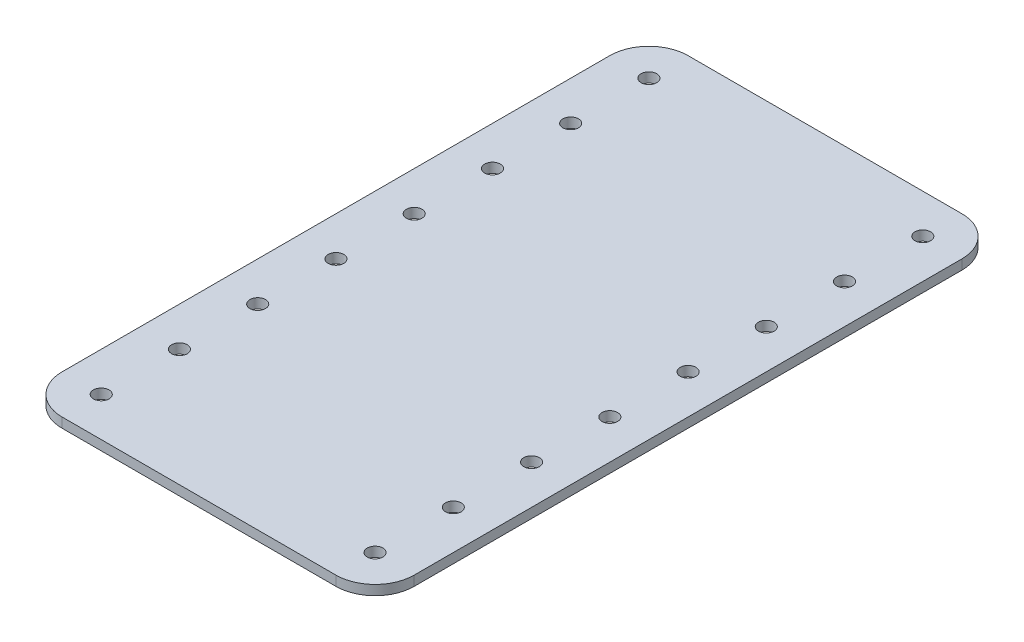
ISO-10303-21;
HEADER;
FILE_DESCRIPTION(('STEP AP214'),'2;1');
FILE_NAME('part.step','',(''),(''),'','','');
FILE_SCHEMA(('AUTOMOTIVE_DESIGN { 1 0 10303 214 1 1 1 1 }'));
ENDSEC;
DATA;
#1=APPLICATION_CONTEXT('core data for automotive mechanical design processes');
#2=APPLICATION_PROTOCOL_DEFINITION('international standard','automotive_design',2000,#1);
#3=PRODUCT_CONTEXT('',#1,'mechanical');
#4=PRODUCT('Part','Part','',(#3));
#5=PRODUCT_RELATED_PRODUCT_CATEGORY('part','',(#4));
#6=PRODUCT_DEFINITION_FORMATION('','',#4);
#7=PRODUCT_DEFINITION_CONTEXT('part definition',#1,'design');
#8=PRODUCT_DEFINITION('design','',#6,#7);
#9=PRODUCT_DEFINITION_SHAPE('','',#8);
#10=(LENGTH_UNIT() NAMED_UNIT(*) SI_UNIT(.MILLI.,.METRE.));
#11=(NAMED_UNIT(*) PLANE_ANGLE_UNIT() SI_UNIT($,.RADIAN.));
#12=(NAMED_UNIT(*) SI_UNIT($,.STERADIAN.) SOLID_ANGLE_UNIT());
#13=UNCERTAINTY_MEASURE_WITH_UNIT(LENGTH_MEASURE(1.E-05),#10,'distance_accuracy_value','');
#14=(GEOMETRIC_REPRESENTATION_CONTEXT(3) GLOBAL_UNCERTAINTY_ASSIGNED_CONTEXT((#13)) GLOBAL_UNIT_ASSIGNED_CONTEXT((#10,
#11,#12)) REPRESENTATION_CONTEXT('',''));
#15=CARTESIAN_POINT('',(0.,0.,0.));
#16=DIRECTION('',(0.,0.,1.));
#17=DIRECTION('',(1.,0.,0.));
#18=AXIS2_PLACEMENT_3D('',#15,#16,#17);
#19=CARTESIAN_POINT('',(57.15,3.175,101.6));
#20=DIRECTION('',(-1.,0.,0.));
#21=DIRECTION('',(0.,0.,1.));
#22=AXIS2_PLACEMENT_3D('',#19,#20,#21);
#23=PLANE('',#22);
#24=DIRECTION('',(0.,0.,-1.));
#25=VECTOR('',#24,1.);
#26=CARTESIAN_POINT('',(57.15,0.,101.6));
#27=LINE('',#26,#25);
#28=CARTESIAN_POINT('',(57.15,0.,88.9));
#29=VERTEX_POINT('',#28);
#30=CARTESIAN_POINT('',(57.15,0.,-88.9));
#31=VERTEX_POINT('',#30);
#32=EDGE_CURVE('E127',#29,#31,#27,.T.);
#33=ORIENTED_EDGE('',*,*,#32,.T.);
#34=DIRECTION('',(0.,-1.,0.));
#35=VECTOR('',#34,1.);
#36=CARTESIAN_POINT('',(57.15,3.175,-88.9));
#37=LINE('',#36,#35);
#38=CARTESIAN_POINT('',(57.15,3.175,-88.9));
#39=VERTEX_POINT('',#38);
#40=EDGE_CURVE('E150',#31,#39,#37,.F.);
#41=ORIENTED_EDGE('',*,*,#40,.T.);
#42=DIRECTION('',(0.,0.,-1.));
#43=VECTOR('',#42,1.);
#44=CARTESIAN_POINT('',(57.15,3.175,101.6));
#45=LINE('',#44,#43);
#46=CARTESIAN_POINT('',(57.15,3.175,88.9));
#47=VERTEX_POINT('',#46);
#48=EDGE_CURVE('E125',#47,#39,#45,.T.);
#49=ORIENTED_EDGE('',*,*,#48,.F.);
#50=DIRECTION('',(0.,-1.,0.));
#51=VECTOR('',#50,1.);
#52=CARTESIAN_POINT('',(57.15,3.175,88.9));
#53=LINE('',#52,#51);
#54=EDGE_CURVE('E147',#47,#29,#53,.T.);
#55=ORIENTED_EDGE('',*,*,#54,.T.);
#56=EDGE_LOOP('',(#33,#41,#49,#55));
#57=FACE_BOUND('',#56,.T.);
#58=ADVANCED_FACE('F32',(#57),#23,.F.);
#59=CARTESIAN_POINT('',(-57.15,3.175,-101.6));
#60=DIRECTION('',(0.,0.,1.));
#61=DIRECTION('',(1.,0.,0.));
#62=AXIS2_PLACEMENT_3D('',#59,#60,#61);
#63=PLANE('',#62);
#64=DIRECTION('',(-1.,0.,0.));
#65=VECTOR('',#64,1.);
#66=CARTESIAN_POINT('',(-57.15,0.,-101.6));
#67=LINE('',#66,#65);
#68=CARTESIAN_POINT('',(44.45,0.,-101.6));
#69=VERTEX_POINT('',#68);
#70=CARTESIAN_POINT('',(-44.45,0.,-101.6));
#71=VERTEX_POINT('',#70);
#72=EDGE_CURVE('E123',#69,#71,#67,.T.);
#73=ORIENTED_EDGE('',*,*,#72,.T.);
#74=DIRECTION('',(0.,-1.,0.));
#75=VECTOR('',#74,1.);
#76=CARTESIAN_POINT('',(-44.45,3.175,-101.6));
#77=LINE('',#76,#75);
#78=CARTESIAN_POINT('',(-44.45,3.175,-101.6));
#79=VERTEX_POINT('',#78);
#80=EDGE_CURVE('E102',#71,#79,#77,.F.);
#81=ORIENTED_EDGE('',*,*,#80,.T.);
#82=DIRECTION('',(-1.,0.,0.));
#83=VECTOR('',#82,1.);
#84=CARTESIAN_POINT('',(-57.15,3.175,-101.6));
#85=LINE('',#84,#83);
#86=CARTESIAN_POINT('',(44.45,3.175,-101.6));
#87=VERTEX_POINT('',#86);
#88=EDGE_CURVE('E166',#87,#79,#85,.T.);
#89=ORIENTED_EDGE('',*,*,#88,.F.);
#90=DIRECTION('',(0.,-1.,0.));
#91=VECTOR('',#90,1.);
#92=CARTESIAN_POINT('',(44.45,3.175,-101.6));
#93=LINE('',#92,#91);
#94=EDGE_CURVE('E107',#87,#69,#93,.T.);
#95=ORIENTED_EDGE('',*,*,#94,.T.);
#96=EDGE_LOOP('',(#73,#81,#89,#95));
#97=FACE_BOUND('',#96,.T.);
#98=ADVANCED_FACE('F317',(#97),#63,.F.);
#99=CARTESIAN_POINT('',(-57.15,3.175,101.6));
#100=DIRECTION('',(1.,0.,0.));
#101=DIRECTION('',(0.,0.,-1.));
#102=AXIS2_PLACEMENT_3D('',#99,#100,#101);
#103=PLANE('',#102);
#104=DIRECTION('',(0.,0.,1.));
#105=VECTOR('',#104,1.);
#106=CARTESIAN_POINT('',(-57.15,3.175,101.6));
#107=LINE('',#106,#105);
#108=CARTESIAN_POINT('',(-57.15,3.175,-88.9));
#109=VERTEX_POINT('',#108);
#110=CARTESIAN_POINT('',(-57.15,3.175,88.9));
#111=VERTEX_POINT('',#110);
#112=EDGE_CURVE('E116',#109,#111,#107,.T.);
#113=ORIENTED_EDGE('',*,*,#112,.F.);
#114=DIRECTION('',(0.,-1.,0.));
#115=VECTOR('',#114,1.);
#116=CARTESIAN_POINT('',(-57.15,3.175,-88.9));
#117=LINE('',#116,#115);
#118=CARTESIAN_POINT('',(-57.15,0.,-88.9));
#119=VERTEX_POINT('',#118);
#120=EDGE_CURVE('E101',#109,#119,#117,.T.);
#121=ORIENTED_EDGE('',*,*,#120,.T.);
#122=DIRECTION('',(0.,0.,1.));
#123=VECTOR('',#122,1.);
#124=CARTESIAN_POINT('',(-57.15,0.,101.6));
#125=LINE('',#124,#123);
#126=CARTESIAN_POINT('',(-57.15,0.,88.9));
#127=VERTEX_POINT('',#126);
#128=EDGE_CURVE('E114',#119,#127,#125,.T.);
#129=ORIENTED_EDGE('',*,*,#128,.T.);
#130=DIRECTION('',(0.,-1.,0.));
#131=VECTOR('',#130,1.);
#132=CARTESIAN_POINT('',(-57.15,3.175,88.9));
#133=LINE('',#132,#131);
#134=EDGE_CURVE('E118',#127,#111,#133,.F.);
#135=ORIENTED_EDGE('',*,*,#134,.T.);
#136=EDGE_LOOP('',(#113,#121,#129,#135));
#137=FACE_BOUND('',#136,.T.);
#138=ADVANCED_FACE('F113',(#137),#103,.F.);
#139=CARTESIAN_POINT('',(-57.15,3.175,101.6));
#140=DIRECTION('',(0.,0.,-1.));
#141=DIRECTION('',(-1.,0.,0.));
#142=AXIS2_PLACEMENT_3D('',#139,#140,#141);
#143=PLANE('',#142);
#144=DIRECTION('',(1.,0.,0.));
#145=VECTOR('',#144,1.);
#146=CARTESIAN_POINT('',(-57.15,0.,101.6));
#147=LINE('',#146,#145);
#148=CARTESIAN_POINT('',(-44.45,0.,101.6));
#149=VERTEX_POINT('',#148);
#150=CARTESIAN_POINT('',(44.45,0.,101.6));
#151=VERTEX_POINT('',#150);
#152=EDGE_CURVE('E122',#149,#151,#147,.T.);
#153=ORIENTED_EDGE('',*,*,#152,.T.);
#154=DIRECTION('',(0.,-1.,0.));
#155=VECTOR('',#154,1.);
#156=CARTESIAN_POINT('',(44.45,3.175,101.6));
#157=LINE('',#156,#155);
#158=CARTESIAN_POINT('',(44.45,3.175,101.6));
#159=VERTEX_POINT('',#158);
#160=EDGE_CURVE('E11',#151,#159,#157,.F.);
#161=ORIENTED_EDGE('',*,*,#160,.T.);
#162=DIRECTION('',(1.,0.,0.));
#163=VECTOR('',#162,1.);
#164=CARTESIAN_POINT('',(-57.15,3.175,101.6));
#165=LINE('',#164,#163);
#166=CARTESIAN_POINT('',(-44.45,3.175,101.6));
#167=VERTEX_POINT('',#166);
#168=EDGE_CURVE('E131',#167,#159,#165,.T.);
#169=ORIENTED_EDGE('',*,*,#168,.F.);
#170=DIRECTION('',(0.,-1.,0.));
#171=VECTOR('',#170,1.);
#172=CARTESIAN_POINT('',(-44.45,3.175,101.6));
#173=LINE('',#172,#171);
#174=EDGE_CURVE('E40',#167,#149,#173,.T.);
#175=ORIENTED_EDGE('',*,*,#174,.T.);
#176=EDGE_LOOP('',(#153,#161,#169,#175));
#177=FACE_BOUND('',#176,.T.);
#178=ADVANCED_FACE('F153',(#177),#143,.F.);
#179=CARTESIAN_POINT('',(0.,3.175,0.));
#180=DIRECTION('',(0.,-1.,0.));
#181=DIRECTION('',(0.,0.,-1.));
#182=AXIS2_PLACEMENT_3D('',#179,#180,#181);
#183=PLANE('',#182);
#184=CARTESIAN_POINT('',(44.45,3.175,-88.9));
#185=DIRECTION('',(0.,1.,0.));
#186=DIRECTION('',(0.,0.,-1.));
#187=AXIS2_PLACEMENT_3D('',#184,#185,#186);
#188=CIRCLE('',#187,2.54);
#189=CARTESIAN_POINT('',(44.45,3.175,-91.44));
#190=VERTEX_POINT('',#189);
#191=EDGE_CURVE('E266',#190,#190,#188,.T.);
#192=ORIENTED_EDGE('',*,*,#191,.F.);
#193=EDGE_LOOP('',(#192));
#194=FACE_BOUND('',#193,.T.);
#195=CARTESIAN_POINT('',(44.4499999999997,3.175,-63.5));
#196=DIRECTION('',(0.,1.,0.));
#197=DIRECTION('',(0.,0.,-1.));
#198=AXIS2_PLACEMENT_3D('',#195,#196,#197);
#199=CIRCLE('',#198,2.54);
#200=CARTESIAN_POINT('',(44.4499999999997,3.175,-66.04));
#201=VERTEX_POINT('',#200);
#202=EDGE_CURVE('E260',#201,#201,#199,.T.);
#203=ORIENTED_EDGE('',*,*,#202,.F.);
#204=EDGE_LOOP('',(#203));
#205=FACE_BOUND('',#204,.T.);
#206=CARTESIAN_POINT('',(44.4499999999995,3.175,-38.1));
#207=DIRECTION('',(0.,1.,0.));
#208=DIRECTION('',(0.,0.,-1.));
#209=AXIS2_PLACEMENT_3D('',#206,#207,#208);
#210=CIRCLE('',#209,2.54);
#211=CARTESIAN_POINT('',(44.4499999999995,3.175,-40.64));
#212=VERTEX_POINT('',#211);
#213=EDGE_CURVE('E254',#212,#212,#210,.T.);
#214=ORIENTED_EDGE('',*,*,#213,.F.);
#215=EDGE_LOOP('',(#214));
#216=FACE_BOUND('',#215,.T.);
#217=CARTESIAN_POINT('',(44.4499999999992,3.175,-12.7));
#218=DIRECTION('',(0.,1.,0.));
#219=DIRECTION('',(0.,0.,-1.));
#220=AXIS2_PLACEMENT_3D('',#217,#218,#219);
#221=CIRCLE('',#220,2.54);
#222=CARTESIAN_POINT('',(44.4499999999992,3.175,-15.24));
#223=VERTEX_POINT('',#222);
#224=EDGE_CURVE('E248',#223,#223,#221,.T.);
#225=ORIENTED_EDGE('',*,*,#224,.F.);
#226=EDGE_LOOP('',(#225));
#227=FACE_BOUND('',#226,.T.);
#228=CARTESIAN_POINT('',(44.4499999999989,3.175,12.7));
#229=DIRECTION('',(0.,1.,0.));
#230=DIRECTION('',(0.,0.,-1.));
#231=AXIS2_PLACEMENT_3D('',#228,#229,#230);
#232=CIRCLE('',#231,2.54);
#233=CARTESIAN_POINT('',(44.4499999999989,3.175,10.16));
#234=VERTEX_POINT('',#233);
#235=EDGE_CURVE('E242',#234,#234,#232,.T.);
#236=ORIENTED_EDGE('',*,*,#235,.F.);
#237=EDGE_LOOP('',(#236));
#238=FACE_BOUND('',#237,.T.);
#239=CARTESIAN_POINT('',(44.4499999999987,3.175,38.1));
#240=DIRECTION('',(0.,1.,0.));
#241=DIRECTION('',(0.,0.,-1.));
#242=AXIS2_PLACEMENT_3D('',#239,#240,#241);
#243=CIRCLE('',#242,2.54);
#244=CARTESIAN_POINT('',(44.4499999999987,3.175,35.56));
#245=VERTEX_POINT('',#244);
#246=EDGE_CURVE('E236',#245,#245,#243,.T.);
#247=ORIENTED_EDGE('',*,*,#246,.F.);
#248=EDGE_LOOP('',(#247));
#249=FACE_BOUND('',#248,.T.);
#250=CARTESIAN_POINT('',(44.4499999999984,3.175,63.5));
#251=DIRECTION('',(0.,1.,0.));
#252=DIRECTION('',(0.,0.,-1.));
#253=AXIS2_PLACEMENT_3D('',#250,#251,#252);
#254=CIRCLE('',#253,2.54);
#255=CARTESIAN_POINT('',(44.4499999999984,3.175,60.96));
#256=VERTEX_POINT('',#255);
#257=EDGE_CURVE('E230',#256,#256,#254,.T.);
#258=ORIENTED_EDGE('',*,*,#257,.F.);
#259=EDGE_LOOP('',(#258));
#260=FACE_BOUND('',#259,.T.);
#261=CARTESIAN_POINT('',(44.4499999999981,3.175,88.9));
#262=DIRECTION('',(0.,1.,0.));
#263=DIRECTION('',(0.,0.,-1.));
#264=AXIS2_PLACEMENT_3D('',#261,#262,#263);
#265=CIRCLE('',#264,2.54);
#266=CARTESIAN_POINT('',(44.4499999999981,3.175,86.36));
#267=VERTEX_POINT('',#266);
#268=EDGE_CURVE('E224',#267,#267,#265,.T.);
#269=ORIENTED_EDGE('',*,*,#268,.F.);
#270=EDGE_LOOP('',(#269));
#271=FACE_BOUND('',#270,.T.);
#272=CARTESIAN_POINT('',(-44.4499999999981,3.175,88.9));
#273=DIRECTION('',(0.,1.,0.));
#274=DIRECTION('',(0.,0.,1.));
#275=AXIS2_PLACEMENT_3D('',#272,#273,#274);
#276=CIRCLE('',#275,2.54);
#277=CARTESIAN_POINT('',(-44.4499999999981,3.175,91.44));
#278=VERTEX_POINT('',#277);
#279=EDGE_CURVE('E218',#278,#278,#276,.T.);
#280=ORIENTED_EDGE('',*,*,#279,.F.);
#281=EDGE_LOOP('',(#280));
#282=FACE_BOUND('',#281,.T.);
#283=CARTESIAN_POINT('',(-44.4499999999984,3.175,63.5));
#284=DIRECTION('',(0.,1.,0.));
#285=DIRECTION('',(0.,0.,1.));
#286=AXIS2_PLACEMENT_3D('',#283,#284,#285);
#287=CIRCLE('',#286,2.54);
#288=CARTESIAN_POINT('',(-44.4499999999984,3.175,66.04));
#289=VERTEX_POINT('',#288);
#290=EDGE_CURVE('E212',#289,#289,#287,.T.);
#291=ORIENTED_EDGE('',*,*,#290,.F.);
#292=EDGE_LOOP('',(#291));
#293=FACE_BOUND('',#292,.T.);
#294=CARTESIAN_POINT('',(-44.4499999999987,3.175,38.1));
#295=DIRECTION('',(0.,1.,0.));
#296=DIRECTION('',(0.,0.,1.));
#297=AXIS2_PLACEMENT_3D('',#294,#295,#296);
#298=CIRCLE('',#297,2.54);
#299=CARTESIAN_POINT('',(-44.4499999999987,3.175,40.64));
#300=VERTEX_POINT('',#299);
#301=EDGE_CURVE('E206',#300,#300,#298,.T.);
#302=ORIENTED_EDGE('',*,*,#301,.F.);
#303=EDGE_LOOP('',(#302));
#304=FACE_BOUND('',#303,.T.);
#305=CARTESIAN_POINT('',(-44.4499999999989,3.175,12.7));
#306=DIRECTION('',(0.,1.,0.));
#307=DIRECTION('',(0.,0.,1.));
#308=AXIS2_PLACEMENT_3D('',#305,#306,#307);
#309=CIRCLE('',#308,2.54);
#310=CARTESIAN_POINT('',(-44.4499999999989,3.175,15.24));
#311=VERTEX_POINT('',#310);
#312=EDGE_CURVE('E200',#311,#311,#309,.T.);
#313=ORIENTED_EDGE('',*,*,#312,.F.);
#314=EDGE_LOOP('',(#313));
#315=FACE_BOUND('',#314,.T.);
#316=CARTESIAN_POINT('',(-44.4499999999992,3.175,-12.7));
#317=DIRECTION('',(0.,1.,0.));
#318=DIRECTION('',(0.,0.,1.));
#319=AXIS2_PLACEMENT_3D('',#316,#317,#318);
#320=CIRCLE('',#319,2.54);
#321=CARTESIAN_POINT('',(-44.4499999999992,3.175,-10.16));
#322=VERTEX_POINT('',#321);
#323=EDGE_CURVE('E194',#322,#322,#320,.T.);
#324=ORIENTED_EDGE('',*,*,#323,.F.);
#325=EDGE_LOOP('',(#324));
#326=FACE_BOUND('',#325,.T.);
#327=CARTESIAN_POINT('',(-44.4499999999995,3.175,-38.1));
#328=DIRECTION('',(0.,1.,0.));
#329=DIRECTION('',(0.,0.,1.));
#330=AXIS2_PLACEMENT_3D('',#327,#328,#329);
#331=CIRCLE('',#330,2.54);
#332=CARTESIAN_POINT('',(-44.4499999999995,3.175,-35.56));
#333=VERTEX_POINT('',#332);
#334=EDGE_CURVE('E188',#333,#333,#331,.T.);
#335=ORIENTED_EDGE('',*,*,#334,.F.);
#336=EDGE_LOOP('',(#335));
#337=FACE_BOUND('',#336,.T.);
#338=CARTESIAN_POINT('',(-44.4499999999997,3.175,-63.5));
#339=DIRECTION('',(0.,1.,0.));
#340=DIRECTION('',(0.,0.,1.));
#341=AXIS2_PLACEMENT_3D('',#338,#339,#340);
#342=CIRCLE('',#341,2.54);
#343=CARTESIAN_POINT('',(-44.4499999999997,3.175,-60.96));
#344=VERTEX_POINT('',#343);
#345=EDGE_CURVE('E182',#344,#344,#342,.T.);
#346=ORIENTED_EDGE('',*,*,#345,.F.);
#347=EDGE_LOOP('',(#346));
#348=FACE_BOUND('',#347,.T.);
#349=CARTESIAN_POINT('',(-44.45,3.175,-88.9));
#350=DIRECTION('',(0.,1.,0.));
#351=DIRECTION('',(0.,0.,1.));
#352=AXIS2_PLACEMENT_3D('',#349,#350,#351);
#353=CIRCLE('',#352,2.54);
#354=CARTESIAN_POINT('',(-44.45,3.175,-86.36));
#355=VERTEX_POINT('',#354);
#356=EDGE_CURVE('E171',#355,#355,#353,.T.);
#357=ORIENTED_EDGE('',*,*,#356,.F.);
#358=EDGE_LOOP('',(#357));
#359=FACE_BOUND('',#358,.T.);
#360=ORIENTED_EDGE('',*,*,#88,.T.);
#361=CARTESIAN_POINT('',(-44.45,3.175,-88.9));
#362=DIRECTION('',(0.,-1.,0.));
#363=DIRECTION('',(0.,0.,-1.));
#364=AXIS2_PLACEMENT_3D('',#361,#362,#363);
#365=CIRCLE('',#364,12.7);
#366=EDGE_CURVE('E145',#79,#109,#365,.F.);
#367=ORIENTED_EDGE('',*,*,#366,.T.);
#368=ORIENTED_EDGE('',*,*,#112,.T.);
#369=CARTESIAN_POINT('',(-44.45,3.175,88.9));
#370=DIRECTION('',(0.,-1.,0.));
#371=DIRECTION('',(0.,0.,-1.));
#372=AXIS2_PLACEMENT_3D('',#369,#370,#371);
#373=CIRCLE('',#372,12.7);
#374=EDGE_CURVE('E52',#111,#167,#373,.F.);
#375=ORIENTED_EDGE('',*,*,#374,.T.);
#376=ORIENTED_EDGE('',*,*,#168,.T.);
#377=CARTESIAN_POINT('',(44.45,3.175,88.9));
#378=DIRECTION('',(0.,-1.,0.));
#379=DIRECTION('',(0.,0.,-1.));
#380=AXIS2_PLACEMENT_3D('',#377,#378,#379);
#381=CIRCLE('',#380,12.7);
#382=EDGE_CURVE('E141',#159,#47,#381,.F.);
#383=ORIENTED_EDGE('',*,*,#382,.T.);
#384=ORIENTED_EDGE('',*,*,#48,.T.);
#385=CARTESIAN_POINT('',(44.45,3.175,-88.9));
#386=DIRECTION('',(0.,-1.,0.));
#387=DIRECTION('',(0.,0.,-1.));
#388=AXIS2_PLACEMENT_3D('',#385,#386,#387);
#389=CIRCLE('',#388,12.7);
#390=EDGE_CURVE('E143',#39,#87,#389,.F.);
#391=ORIENTED_EDGE('',*,*,#390,.T.);
#392=EDGE_LOOP('',(#360,#367,#368,#375,#376,#383,#384,#391));
#393=FACE_BOUND('',#392,.T.);
#394=ADVANCED_FACE('F281',(#194,#205,#216,#227,#238,#249,#260,#271,#282,#293,#304,#315,#326,
#337,#348,#359,#393),#183,.F.);
#395=CARTESIAN_POINT('',(0.,0.,0.));
#396=DIRECTION('',(0.,-1.,0.));
#397=DIRECTION('',(0.,0.,-1.));
#398=AXIS2_PLACEMENT_3D('',#395,#396,#397);
#399=PLANE('',#398);
#400=CARTESIAN_POINT('',(44.45,0.,-88.9));
#401=DIRECTION('',(0.,1.,0.));
#402=DIRECTION('',(0.,0.,-1.));
#403=AXIS2_PLACEMENT_3D('',#400,#401,#402);
#404=CIRCLE('',#403,2.54);
#405=CARTESIAN_POINT('',(44.45,0.,-91.44));
#406=VERTEX_POINT('',#405);
#407=EDGE_CURVE('E263',#406,#406,#404,.T.);
#408=ORIENTED_EDGE('',*,*,#407,.T.);
#409=EDGE_LOOP('',(#408));
#410=FACE_BOUND('',#409,.T.);
#411=CARTESIAN_POINT('',(44.4499999999997,0.,-63.5));
#412=DIRECTION('',(0.,1.,0.));
#413=DIRECTION('',(0.,0.,-1.));
#414=AXIS2_PLACEMENT_3D('',#411,#412,#413);
#415=CIRCLE('',#414,2.54);
#416=CARTESIAN_POINT('',(44.4499999999997,0.,-66.04));
#417=VERTEX_POINT('',#416);
#418=EDGE_CURVE('E257',#417,#417,#415,.T.);
#419=ORIENTED_EDGE('',*,*,#418,.T.);
#420=EDGE_LOOP('',(#419));
#421=FACE_BOUND('',#420,.T.);
#422=CARTESIAN_POINT('',(44.4499999999995,0.,-38.1));
#423=DIRECTION('',(0.,1.,0.));
#424=DIRECTION('',(0.,0.,-1.));
#425=AXIS2_PLACEMENT_3D('',#422,#423,#424);
#426=CIRCLE('',#425,2.54);
#427=CARTESIAN_POINT('',(44.4499999999995,0.,-40.64));
#428=VERTEX_POINT('',#427);
#429=EDGE_CURVE('E251',#428,#428,#426,.T.);
#430=ORIENTED_EDGE('',*,*,#429,.T.);
#431=EDGE_LOOP('',(#430));
#432=FACE_BOUND('',#431,.T.);
#433=CARTESIAN_POINT('',(44.4499999999992,0.,-12.7));
#434=DIRECTION('',(0.,1.,0.));
#435=DIRECTION('',(0.,0.,-1.));
#436=AXIS2_PLACEMENT_3D('',#433,#434,#435);
#437=CIRCLE('',#436,2.54);
#438=CARTESIAN_POINT('',(44.4499999999992,0.,-15.24));
#439=VERTEX_POINT('',#438);
#440=EDGE_CURVE('E245',#439,#439,#437,.T.);
#441=ORIENTED_EDGE('',*,*,#440,.T.);
#442=EDGE_LOOP('',(#441));
#443=FACE_BOUND('',#442,.T.);
#444=CARTESIAN_POINT('',(44.4499999999989,0.,12.7));
#445=DIRECTION('',(0.,1.,0.));
#446=DIRECTION('',(0.,0.,-1.));
#447=AXIS2_PLACEMENT_3D('',#444,#445,#446);
#448=CIRCLE('',#447,2.54);
#449=CARTESIAN_POINT('',(44.4499999999989,0.,10.16));
#450=VERTEX_POINT('',#449);
#451=EDGE_CURVE('E239',#450,#450,#448,.T.);
#452=ORIENTED_EDGE('',*,*,#451,.T.);
#453=EDGE_LOOP('',(#452));
#454=FACE_BOUND('',#453,.T.);
#455=CARTESIAN_POINT('',(44.4499999999987,0.,38.1));
#456=DIRECTION('',(0.,1.,0.));
#457=DIRECTION('',(0.,0.,-1.));
#458=AXIS2_PLACEMENT_3D('',#455,#456,#457);
#459=CIRCLE('',#458,2.54);
#460=CARTESIAN_POINT('',(44.4499999999987,0.,35.56));
#461=VERTEX_POINT('',#460);
#462=EDGE_CURVE('E233',#461,#461,#459,.T.);
#463=ORIENTED_EDGE('',*,*,#462,.T.);
#464=EDGE_LOOP('',(#463));
#465=FACE_BOUND('',#464,.T.);
#466=CARTESIAN_POINT('',(44.4499999999984,0.,63.5));
#467=DIRECTION('',(0.,1.,0.));
#468=DIRECTION('',(0.,0.,-1.));
#469=AXIS2_PLACEMENT_3D('',#466,#467,#468);
#470=CIRCLE('',#469,2.54);
#471=CARTESIAN_POINT('',(44.4499999999984,0.,60.96));
#472=VERTEX_POINT('',#471);
#473=EDGE_CURVE('E227',#472,#472,#470,.T.);
#474=ORIENTED_EDGE('',*,*,#473,.T.);
#475=EDGE_LOOP('',(#474));
#476=FACE_BOUND('',#475,.T.);
#477=CARTESIAN_POINT('',(44.4499999999981,0.,88.9));
#478=DIRECTION('',(0.,1.,0.));
#479=DIRECTION('',(0.,0.,-1.));
#480=AXIS2_PLACEMENT_3D('',#477,#478,#479);
#481=CIRCLE('',#480,2.54);
#482=CARTESIAN_POINT('',(44.4499999999981,0.,86.36));
#483=VERTEX_POINT('',#482);
#484=EDGE_CURVE('E221',#483,#483,#481,.T.);
#485=ORIENTED_EDGE('',*,*,#484,.T.);
#486=EDGE_LOOP('',(#485));
#487=FACE_BOUND('',#486,.T.);
#488=CARTESIAN_POINT('',(-44.4499999999981,0.,88.9));
#489=DIRECTION('',(0.,1.,0.));
#490=DIRECTION('',(0.,0.,1.));
#491=AXIS2_PLACEMENT_3D('',#488,#489,#490);
#492=CIRCLE('',#491,2.54);
#493=CARTESIAN_POINT('',(-44.4499999999981,0.,91.44));
#494=VERTEX_POINT('',#493);
#495=EDGE_CURVE('E215',#494,#494,#492,.T.);
#496=ORIENTED_EDGE('',*,*,#495,.T.);
#497=EDGE_LOOP('',(#496));
#498=FACE_BOUND('',#497,.T.);
#499=CARTESIAN_POINT('',(-44.4499999999984,0.,63.5));
#500=DIRECTION('',(0.,1.,0.));
#501=DIRECTION('',(0.,0.,1.));
#502=AXIS2_PLACEMENT_3D('',#499,#500,#501);
#503=CIRCLE('',#502,2.54);
#504=CARTESIAN_POINT('',(-44.4499999999984,0.,66.04));
#505=VERTEX_POINT('',#504);
#506=EDGE_CURVE('E209',#505,#505,#503,.T.);
#507=ORIENTED_EDGE('',*,*,#506,.T.);
#508=EDGE_LOOP('',(#507));
#509=FACE_BOUND('',#508,.T.);
#510=CARTESIAN_POINT('',(-44.4499999999987,0.,38.1));
#511=DIRECTION('',(0.,1.,0.));
#512=DIRECTION('',(0.,0.,1.));
#513=AXIS2_PLACEMENT_3D('',#510,#511,#512);
#514=CIRCLE('',#513,2.54);
#515=CARTESIAN_POINT('',(-44.4499999999987,0.,40.64));
#516=VERTEX_POINT('',#515);
#517=EDGE_CURVE('E203',#516,#516,#514,.T.);
#518=ORIENTED_EDGE('',*,*,#517,.T.);
#519=EDGE_LOOP('',(#518));
#520=FACE_BOUND('',#519,.T.);
#521=CARTESIAN_POINT('',(-44.4499999999989,0.,12.7));
#522=DIRECTION('',(0.,1.,0.));
#523=DIRECTION('',(0.,0.,1.));
#524=AXIS2_PLACEMENT_3D('',#521,#522,#523);
#525=CIRCLE('',#524,2.54);
#526=CARTESIAN_POINT('',(-44.4499999999989,0.,15.24));
#527=VERTEX_POINT('',#526);
#528=EDGE_CURVE('E197',#527,#527,#525,.T.);
#529=ORIENTED_EDGE('',*,*,#528,.T.);
#530=EDGE_LOOP('',(#529));
#531=FACE_BOUND('',#530,.T.);
#532=CARTESIAN_POINT('',(-44.4499999999992,0.,-12.7));
#533=DIRECTION('',(0.,1.,0.));
#534=DIRECTION('',(0.,0.,1.));
#535=AXIS2_PLACEMENT_3D('',#532,#533,#534);
#536=CIRCLE('',#535,2.54);
#537=CARTESIAN_POINT('',(-44.4499999999992,0.,-10.16));
#538=VERTEX_POINT('',#537);
#539=EDGE_CURVE('E191',#538,#538,#536,.T.);
#540=ORIENTED_EDGE('',*,*,#539,.T.);
#541=EDGE_LOOP('',(#540));
#542=FACE_BOUND('',#541,.T.);
#543=CARTESIAN_POINT('',(-44.4499999999995,0.,-38.1));
#544=DIRECTION('',(0.,1.,0.));
#545=DIRECTION('',(0.,0.,1.));
#546=AXIS2_PLACEMENT_3D('',#543,#544,#545);
#547=CIRCLE('',#546,2.54);
#548=CARTESIAN_POINT('',(-44.4499999999995,0.,-35.56));
#549=VERTEX_POINT('',#548);
#550=EDGE_CURVE('E185',#549,#549,#547,.T.);
#551=ORIENTED_EDGE('',*,*,#550,.T.);
#552=EDGE_LOOP('',(#551));
#553=FACE_BOUND('',#552,.T.);
#554=CARTESIAN_POINT('',(-44.4499999999997,0.,-63.5));
#555=DIRECTION('',(0.,1.,0.));
#556=DIRECTION('',(0.,0.,1.));
#557=AXIS2_PLACEMENT_3D('',#554,#555,#556);
#558=CIRCLE('',#557,2.54);
#559=CARTESIAN_POINT('',(-44.4499999999997,0.,-60.96));
#560=VERTEX_POINT('',#559);
#561=EDGE_CURVE('E180',#560,#560,#558,.T.);
#562=ORIENTED_EDGE('',*,*,#561,.T.);
#563=EDGE_LOOP('',(#562));
#564=FACE_BOUND('',#563,.T.);
#565=CARTESIAN_POINT('',(-44.45,0.,-88.9));
#566=DIRECTION('',(0.,1.,0.));
#567=DIRECTION('',(0.,0.,1.));
#568=AXIS2_PLACEMENT_3D('',#565,#566,#567);
#569=CIRCLE('',#568,2.54);
#570=CARTESIAN_POINT('',(-44.45,0.,-86.36));
#571=VERTEX_POINT('',#570);
#572=EDGE_CURVE('E175',#571,#571,#569,.T.);
#573=ORIENTED_EDGE('',*,*,#572,.T.);
#574=EDGE_LOOP('',(#573));
#575=FACE_BOUND('',#574,.T.);
#576=ORIENTED_EDGE('',*,*,#128,.F.);
#577=CARTESIAN_POINT('',(-44.45,0.,-88.9));
#578=DIRECTION('',(0.,-1.,0.));
#579=DIRECTION('',(0.,0.,-1.));
#580=AXIS2_PLACEMENT_3D('',#577,#578,#579);
#581=CIRCLE('',#580,12.7);
#582=EDGE_CURVE('E97',#119,#71,#581,.T.);
#583=ORIENTED_EDGE('',*,*,#582,.T.);
#584=ORIENTED_EDGE('',*,*,#72,.F.);
#585=CARTESIAN_POINT('',(44.45,0.,-88.9));
#586=DIRECTION('',(0.,-1.,0.));
#587=DIRECTION('',(0.,0.,-1.));
#588=AXIS2_PLACEMENT_3D('',#585,#586,#587);
#589=CIRCLE('',#588,12.7);
#590=EDGE_CURVE('E108',#69,#31,#589,.T.);
#591=ORIENTED_EDGE('',*,*,#590,.T.);
#592=ORIENTED_EDGE('',*,*,#32,.F.);
#593=CARTESIAN_POINT('',(44.45,0.,88.9));
#594=DIRECTION('',(0.,-1.,0.));
#595=DIRECTION('',(0.,0.,-1.));
#596=AXIS2_PLACEMENT_3D('',#593,#594,#595);
#597=CIRCLE('',#596,12.7);
#598=EDGE_CURVE('E134',#29,#151,#597,.T.);
#599=ORIENTED_EDGE('',*,*,#598,.T.);
#600=ORIENTED_EDGE('',*,*,#152,.F.);
#601=CARTESIAN_POINT('',(-44.45,0.,88.9));
#602=DIRECTION('',(0.,-1.,0.));
#603=DIRECTION('',(0.,0.,-1.));
#604=AXIS2_PLACEMENT_3D('',#601,#602,#603);
#605=CIRCLE('',#604,12.7);
#606=EDGE_CURVE('E117',#149,#127,#605,.T.);
#607=ORIENTED_EDGE('',*,*,#606,.T.);
#608=EDGE_LOOP('',(#576,#583,#584,#591,#592,#599,#600,#607));
#609=FACE_BOUND('',#608,.T.);
#610=ADVANCED_FACE('F120',(#410,#421,#432,#443,#454,#465,#476,#487,#498,#509,#520,#531,#542,
#553,#564,#575,#609),#399,.T.);
#611=CARTESIAN_POINT('',(-44.45,0.,-88.9));
#612=DIRECTION('',(0.,1.,0.));
#613=DIRECTION('',(0.,0.,1.));
#614=AXIS2_PLACEMENT_3D('',#611,#612,#613);
#615=CYLINDRICAL_SURFACE('',#614,2.54);
#616=ORIENTED_EDGE('',*,*,#572,.F.);
#617=EDGE_LOOP('',(#616));
#618=FACE_BOUND('',#617,.T.);
#619=ORIENTED_EDGE('',*,*,#356,.T.);
#620=EDGE_LOOP('',(#619));
#621=FACE_BOUND('',#620,.T.);
#622=ADVANCED_FACE('F339',(#618,#621),#615,.F.);
#623=CARTESIAN_POINT('',(-44.4499999999997,0.,-63.5));
#624=DIRECTION('',(0.,1.,0.));
#625=DIRECTION('',(0.,0.,1.));
#626=AXIS2_PLACEMENT_3D('',#623,#624,#625);
#627=CYLINDRICAL_SURFACE('',#626,2.54);
#628=ORIENTED_EDGE('',*,*,#561,.F.);
#629=EDGE_LOOP('',(#628));
#630=FACE_BOUND('',#629,.T.);
#631=ORIENTED_EDGE('',*,*,#345,.T.);
#632=EDGE_LOOP('',(#631));
#633=FACE_BOUND('',#632,.T.);
#634=ADVANCED_FACE('F343',(#630,#633),#627,.F.);
#635=CARTESIAN_POINT('',(-44.4499999999995,0.,-38.1));
#636=DIRECTION('',(0.,1.,0.));
#637=DIRECTION('',(0.,0.,1.));
#638=AXIS2_PLACEMENT_3D('',#635,#636,#637);
#639=CYLINDRICAL_SURFACE('',#638,2.54);
#640=ORIENTED_EDGE('',*,*,#550,.F.);
#641=EDGE_LOOP('',(#640));
#642=FACE_BOUND('',#641,.T.);
#643=ORIENTED_EDGE('',*,*,#334,.T.);
#644=EDGE_LOOP('',(#643));
#645=FACE_BOUND('',#644,.T.);
#646=ADVANCED_FACE('F347',(#642,#645),#639,.F.);
#647=CARTESIAN_POINT('',(-44.4499999999992,0.,-12.7));
#648=DIRECTION('',(0.,1.,0.));
#649=DIRECTION('',(0.,0.,1.));
#650=AXIS2_PLACEMENT_3D('',#647,#648,#649);
#651=CYLINDRICAL_SURFACE('',#650,2.54);
#652=ORIENTED_EDGE('',*,*,#539,.F.);
#653=EDGE_LOOP('',(#652));
#654=FACE_BOUND('',#653,.T.);
#655=ORIENTED_EDGE('',*,*,#323,.T.);
#656=EDGE_LOOP('',(#655));
#657=FACE_BOUND('',#656,.T.);
#658=ADVANCED_FACE('F351',(#654,#657),#651,.F.);
#659=CARTESIAN_POINT('',(-44.4499999999989,0.,12.7));
#660=DIRECTION('',(0.,1.,0.));
#661=DIRECTION('',(0.,0.,1.));
#662=AXIS2_PLACEMENT_3D('',#659,#660,#661);
#663=CYLINDRICAL_SURFACE('',#662,2.54);
#664=ORIENTED_EDGE('',*,*,#528,.F.);
#665=EDGE_LOOP('',(#664));
#666=FACE_BOUND('',#665,.T.);
#667=ORIENTED_EDGE('',*,*,#312,.T.);
#668=EDGE_LOOP('',(#667));
#669=FACE_BOUND('',#668,.T.);
#670=ADVANCED_FACE('F355',(#666,#669),#663,.F.);
#671=CARTESIAN_POINT('',(-44.4499999999987,0.,38.1));
#672=DIRECTION('',(0.,1.,0.));
#673=DIRECTION('',(0.,0.,1.));
#674=AXIS2_PLACEMENT_3D('',#671,#672,#673);
#675=CYLINDRICAL_SURFACE('',#674,2.54);
#676=ORIENTED_EDGE('',*,*,#517,.F.);
#677=EDGE_LOOP('',(#676));
#678=FACE_BOUND('',#677,.T.);
#679=ORIENTED_EDGE('',*,*,#301,.T.);
#680=EDGE_LOOP('',(#679));
#681=FACE_BOUND('',#680,.T.);
#682=ADVANCED_FACE('F359',(#678,#681),#675,.F.);
#683=CARTESIAN_POINT('',(-44.4499999999984,0.,63.5));
#684=DIRECTION('',(0.,1.,0.));
#685=DIRECTION('',(0.,0.,1.));
#686=AXIS2_PLACEMENT_3D('',#683,#684,#685);
#687=CYLINDRICAL_SURFACE('',#686,2.54);
#688=ORIENTED_EDGE('',*,*,#506,.F.);
#689=EDGE_LOOP('',(#688));
#690=FACE_BOUND('',#689,.T.);
#691=ORIENTED_EDGE('',*,*,#290,.T.);
#692=EDGE_LOOP('',(#691));
#693=FACE_BOUND('',#692,.T.);
#694=ADVANCED_FACE('F363',(#690,#693),#687,.F.);
#695=CARTESIAN_POINT('',(-44.4499999999981,0.,88.9));
#696=DIRECTION('',(0.,1.,0.));
#697=DIRECTION('',(0.,0.,1.));
#698=AXIS2_PLACEMENT_3D('',#695,#696,#697);
#699=CYLINDRICAL_SURFACE('',#698,2.54);
#700=ORIENTED_EDGE('',*,*,#495,.F.);
#701=EDGE_LOOP('',(#700));
#702=FACE_BOUND('',#701,.T.);
#703=ORIENTED_EDGE('',*,*,#279,.T.);
#704=EDGE_LOOP('',(#703));
#705=FACE_BOUND('',#704,.T.);
#706=ADVANCED_FACE('F367',(#702,#705),#699,.F.);
#707=CARTESIAN_POINT('',(44.4499999999981,0.,88.9));
#708=DIRECTION('',(0.,1.,0.));
#709=DIRECTION('',(0.,0.,1.));
#710=AXIS2_PLACEMENT_3D('',#707,#708,#709);
#711=CYLINDRICAL_SURFACE('',#710,2.54);
#712=ORIENTED_EDGE('',*,*,#484,.F.);
#713=EDGE_LOOP('',(#712));
#714=FACE_BOUND('',#713,.T.);
#715=ORIENTED_EDGE('',*,*,#268,.T.);
#716=EDGE_LOOP('',(#715));
#717=FACE_BOUND('',#716,.T.);
#718=ADVANCED_FACE('F371',(#714,#717),#711,.F.);
#719=CARTESIAN_POINT('',(44.4499999999984,0.,63.5));
#720=DIRECTION('',(0.,1.,0.));
#721=DIRECTION('',(0.,0.,1.));
#722=AXIS2_PLACEMENT_3D('',#719,#720,#721);
#723=CYLINDRICAL_SURFACE('',#722,2.54);
#724=ORIENTED_EDGE('',*,*,#473,.F.);
#725=EDGE_LOOP('',(#724));
#726=FACE_BOUND('',#725,.T.);
#727=ORIENTED_EDGE('',*,*,#257,.T.);
#728=EDGE_LOOP('',(#727));
#729=FACE_BOUND('',#728,.T.);
#730=ADVANCED_FACE('F375',(#726,#729),#723,.F.);
#731=CARTESIAN_POINT('',(44.4499999999987,0.,38.1));
#732=DIRECTION('',(0.,1.,0.));
#733=DIRECTION('',(0.,0.,1.));
#734=AXIS2_PLACEMENT_3D('',#731,#732,#733);
#735=CYLINDRICAL_SURFACE('',#734,2.54);
#736=ORIENTED_EDGE('',*,*,#462,.F.);
#737=EDGE_LOOP('',(#736));
#738=FACE_BOUND('',#737,.T.);
#739=ORIENTED_EDGE('',*,*,#246,.T.);
#740=EDGE_LOOP('',(#739));
#741=FACE_BOUND('',#740,.T.);
#742=ADVANCED_FACE('F379',(#738,#741),#735,.F.);
#743=CARTESIAN_POINT('',(44.4499999999989,0.,12.7));
#744=DIRECTION('',(0.,1.,0.));
#745=DIRECTION('',(0.,0.,1.));
#746=AXIS2_PLACEMENT_3D('',#743,#744,#745);
#747=CYLINDRICAL_SURFACE('',#746,2.54);
#748=ORIENTED_EDGE('',*,*,#451,.F.);
#749=EDGE_LOOP('',(#748));
#750=FACE_BOUND('',#749,.T.);
#751=ORIENTED_EDGE('',*,*,#235,.T.);
#752=EDGE_LOOP('',(#751));
#753=FACE_BOUND('',#752,.T.);
#754=ADVANCED_FACE('F383',(#750,#753),#747,.F.);
#755=CARTESIAN_POINT('',(44.4499999999992,0.,-12.7));
#756=DIRECTION('',(0.,1.,0.));
#757=DIRECTION('',(0.,0.,1.));
#758=AXIS2_PLACEMENT_3D('',#755,#756,#757);
#759=CYLINDRICAL_SURFACE('',#758,2.54);
#760=ORIENTED_EDGE('',*,*,#440,.F.);
#761=EDGE_LOOP('',(#760));
#762=FACE_BOUND('',#761,.T.);
#763=ORIENTED_EDGE('',*,*,#224,.T.);
#764=EDGE_LOOP('',(#763));
#765=FACE_BOUND('',#764,.T.);
#766=ADVANCED_FACE('F387',(#762,#765),#759,.F.);
#767=CARTESIAN_POINT('',(44.4499999999995,0.,-38.1));
#768=DIRECTION('',(0.,1.,0.));
#769=DIRECTION('',(0.,0.,1.));
#770=AXIS2_PLACEMENT_3D('',#767,#768,#769);
#771=CYLINDRICAL_SURFACE('',#770,2.54);
#772=ORIENTED_EDGE('',*,*,#429,.F.);
#773=EDGE_LOOP('',(#772));
#774=FACE_BOUND('',#773,.T.);
#775=ORIENTED_EDGE('',*,*,#213,.T.);
#776=EDGE_LOOP('',(#775));
#777=FACE_BOUND('',#776,.T.);
#778=ADVANCED_FACE('F391',(#774,#777),#771,.F.);
#779=CARTESIAN_POINT('',(44.4499999999997,0.,-63.5));
#780=DIRECTION('',(0.,1.,0.));
#781=DIRECTION('',(0.,0.,1.));
#782=AXIS2_PLACEMENT_3D('',#779,#780,#781);
#783=CYLINDRICAL_SURFACE('',#782,2.54);
#784=ORIENTED_EDGE('',*,*,#418,.F.);
#785=EDGE_LOOP('',(#784));
#786=FACE_BOUND('',#785,.T.);
#787=ORIENTED_EDGE('',*,*,#202,.T.);
#788=EDGE_LOOP('',(#787));
#789=FACE_BOUND('',#788,.T.);
#790=ADVANCED_FACE('F277',(#786,#789),#783,.F.);
#791=CARTESIAN_POINT('',(44.45,0.,-88.9));
#792=DIRECTION('',(0.,1.,0.));
#793=DIRECTION('',(0.,0.,1.));
#794=AXIS2_PLACEMENT_3D('',#791,#792,#793);
#795=CYLINDRICAL_SURFACE('',#794,2.54);
#796=ORIENTED_EDGE('',*,*,#407,.F.);
#797=EDGE_LOOP('',(#796));
#798=FACE_BOUND('',#797,.T.);
#799=ORIENTED_EDGE('',*,*,#191,.T.);
#800=EDGE_LOOP('',(#799));
#801=FACE_BOUND('',#800,.T.);
#802=ADVANCED_FACE('F274',(#798,#801),#795,.F.);
#803=CARTESIAN_POINT('',(-44.45,3.175,-88.9));
#804=DIRECTION('',(0.,-1.,0.));
#805=DIRECTION('',(0.,0.,-1.));
#806=AXIS2_PLACEMENT_3D('',#803,#804,#805);
#807=CYLINDRICAL_SURFACE('',#806,12.7);
#808=ORIENTED_EDGE('',*,*,#366,.F.);
#809=ORIENTED_EDGE('',*,*,#80,.F.);
#810=ORIENTED_EDGE('',*,*,#582,.F.);
#811=ORIENTED_EDGE('',*,*,#120,.F.);
#812=EDGE_LOOP('',(#808,#809,#810,#811));
#813=FACE_BOUND('',#812,.T.);
#814=ADVANCED_FACE('F100',(#813),#807,.T.);
#815=CARTESIAN_POINT('',(44.45,3.175,-88.9));
#816=DIRECTION('',(0.,-1.,0.));
#817=DIRECTION('',(0.,0.,-1.));
#818=AXIS2_PLACEMENT_3D('',#815,#816,#817);
#819=CYLINDRICAL_SURFACE('',#818,12.7);
#820=ORIENTED_EDGE('',*,*,#390,.F.);
#821=ORIENTED_EDGE('',*,*,#40,.F.);
#822=ORIENTED_EDGE('',*,*,#590,.F.);
#823=ORIENTED_EDGE('',*,*,#94,.F.);
#824=EDGE_LOOP('',(#820,#821,#822,#823));
#825=FACE_BOUND('',#824,.T.);
#826=ADVANCED_FACE('F319',(#825),#819,.T.);
#827=CARTESIAN_POINT('',(44.45,3.175,88.9));
#828=DIRECTION('',(0.,-1.,0.));
#829=DIRECTION('',(0.,0.,-1.));
#830=AXIS2_PLACEMENT_3D('',#827,#828,#829);
#831=CYLINDRICAL_SURFACE('',#830,12.7);
#832=ORIENTED_EDGE('',*,*,#382,.F.);
#833=ORIENTED_EDGE('',*,*,#160,.F.);
#834=ORIENTED_EDGE('',*,*,#598,.F.);
#835=ORIENTED_EDGE('',*,*,#54,.F.);
#836=EDGE_LOOP('',(#832,#833,#834,#835));
#837=FACE_BOUND('',#836,.T.);
#838=ADVANCED_FACE('F160',(#837),#831,.T.);
#839=CARTESIAN_POINT('',(-44.45,3.175,88.9));
#840=DIRECTION('',(0.,-1.,0.));
#841=DIRECTION('',(0.,0.,-1.));
#842=AXIS2_PLACEMENT_3D('',#839,#840,#841);
#843=CYLINDRICAL_SURFACE('',#842,12.7);
#844=ORIENTED_EDGE('',*,*,#374,.F.);
#845=ORIENTED_EDGE('',*,*,#134,.F.);
#846=ORIENTED_EDGE('',*,*,#606,.F.);
#847=ORIENTED_EDGE('',*,*,#174,.F.);
#848=EDGE_LOOP('',(#844,#845,#846,#847));
#849=FACE_BOUND('',#848,.T.);
#850=ADVANCED_FACE('F34',(#849),#843,.T.);
#851=CLOSED_SHELL('',(#58,#98,#138,#178,#394,#610,#622,#634,#646,#658,#670,#682,#694,#706,#718,
#730,#742,#754,#766,#778,#790,#802,#814,#826,#838,#850));
#852=MANIFOLD_SOLID_BREP('B2',#851);
#853=ADVANCED_BREP_SHAPE_REPRESENTATION('',(#18,#852),#14);
#854=SHAPE_DEFINITION_REPRESENTATION(#9,#853);
ENDSEC;
END-ISO-10303-21;
